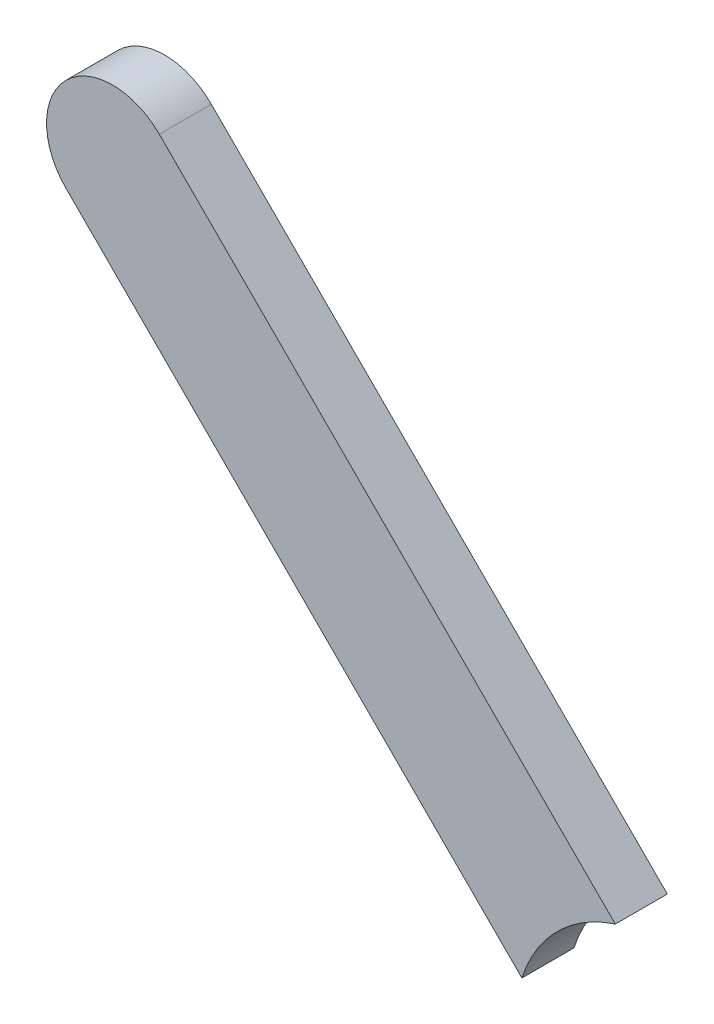
ISO-10303-21;
HEADER;
FILE_DESCRIPTION(('STEP AP214'),'2;1');
FILE_NAME('part.step','',(''),(''),'','','');
FILE_SCHEMA(('AUTOMOTIVE_DESIGN { 1 0 10303 214 1 1 1 1 }'));
ENDSEC;
DATA;
#1=APPLICATION_CONTEXT('core data for automotive mechanical design processes');
#2=APPLICATION_PROTOCOL_DEFINITION('international standard','automotive_design',2000,#1);
#3=PRODUCT_CONTEXT('',#1,'mechanical');
#4=PRODUCT('Part','Part','',(#3));
#5=PRODUCT_RELATED_PRODUCT_CATEGORY('part','',(#4));
#6=PRODUCT_DEFINITION_FORMATION('','',#4);
#7=PRODUCT_DEFINITION_CONTEXT('part definition',#1,'design');
#8=PRODUCT_DEFINITION('design','',#6,#7);
#9=PRODUCT_DEFINITION_SHAPE('','',#8);
#10=(LENGTH_UNIT() NAMED_UNIT(*) SI_UNIT(.MILLI.,.METRE.));
#11=(NAMED_UNIT(*) PLANE_ANGLE_UNIT() SI_UNIT($,.RADIAN.));
#12=(NAMED_UNIT(*) SI_UNIT($,.STERADIAN.) SOLID_ANGLE_UNIT());
#13=UNCERTAINTY_MEASURE_WITH_UNIT(LENGTH_MEASURE(1.E-05),#10,'distance_accuracy_value','');
#14=(GEOMETRIC_REPRESENTATION_CONTEXT(3) GLOBAL_UNCERTAINTY_ASSIGNED_CONTEXT((#13)) GLOBAL_UNIT_ASSIGNED_CONTEXT((#10,
#11,#12)) REPRESENTATION_CONTEXT('',''));
#15=CARTESIAN_POINT('',(0.,0.,0.));
#16=DIRECTION('',(0.,0.,1.));
#17=DIRECTION('',(1.,0.,0.));
#18=AXIS2_PLACEMENT_3D('',#15,#16,#17);
#19=CARTESIAN_POINT('',(91.57088366,82.6919098,0.));
#20=DIRECTION('',(0.707106781186545,0.70710678118655,0.));
#21=DIRECTION('',(0.70710678118655,-0.707106781186545,0.));
#22=AXIS2_PLACEMENT_3D('',#19,#20,#21);
#23=PLANE('',#22);
#24=DIRECTION('',(0.70710678118655,-0.707106781186545,0.));
#25=VECTOR('',#24,1.);
#26=CARTESIAN_POINT('',(91.57088366,82.6919098,0.1999996));
#27=LINE('',#26,#25);
#28=CARTESIAN_POINT('',(91.57088366,82.6919098,0.1999996));
#29=VERTEX_POINT('',#28);
#30=CARTESIAN_POINT('',(93.3244615951531,80.9383318648469,0.1999996));
#31=VERTEX_POINT('',#30);
#32=EDGE_CURVE('E11',#29,#31,#27,.T.);
#33=ORIENTED_EDGE('',*,*,#32,.F.);
#34=DIRECTION('',(0.,0.,1.));
#35=VECTOR('',#34,1.);
#36=CARTESIAN_POINT('',(91.57088366,82.6919098,0.));
#37=LINE('',#36,#35);
#38=CARTESIAN_POINT('',(91.57088366,82.6919098,0.));
#39=VERTEX_POINT('',#38);
#40=EDGE_CURVE('E24',#39,#29,#37,.T.);
#41=ORIENTED_EDGE('',*,*,#40,.F.);
#42=DIRECTION('',(0.70710678118655,-0.707106781186545,0.));
#43=VECTOR('',#42,1.);
#44=CARTESIAN_POINT('',(91.57088366,82.6919098,0.));
#45=LINE('',#44,#43);
#46=CARTESIAN_POINT('',(93.3244615951531,80.9383318648469,0.));
#47=VERTEX_POINT('',#46);
#48=EDGE_CURVE('E75',#39,#47,#45,.T.);
#49=ORIENTED_EDGE('',*,*,#48,.T.);
#50=DIRECTION('',(0.,0.,1.));
#51=VECTOR('',#50,1.);
#52=CARTESIAN_POINT('',(93.3244615951531,80.9383318648469,0.));
#53=LINE('',#52,#51);
#54=EDGE_CURVE('E37',#47,#31,#53,.T.);
#55=ORIENTED_EDGE('',*,*,#54,.T.);
#56=EDGE_LOOP('',(#33,#41,#49,#55));
#57=FACE_BOUND('',#56,.T.);
#58=ADVANCED_FACE('F17',(#57),#23,.F.);
#59=CARTESIAN_POINT('',(93.853,80.7690028,0.));
#60=DIRECTION('',(0.,0.,-1.));
#61=DIRECTION('',(1.,0.,0.));
#62=AXIS2_PLACEMENT_3D('',#59,#60,#61);
#63=CYLINDRICAL_SURFACE('',#62,0.55500016);
#64=DIRECTION('',(0.,0.,1.));
#65=VECTOR('',#64,1.);
#66=CARTESIAN_POINT('',(93.6836709351531,81.2975412048469,0.));
#67=LINE('',#66,#65);
#68=CARTESIAN_POINT('',(93.6836709351531,81.2975412048469,0.));
#69=VERTEX_POINT('',#68);
#70=CARTESIAN_POINT('',(93.6836709351531,81.2975412048469,0.1999996));
#71=VERTEX_POINT('',#70);
#72=EDGE_CURVE('E67',#69,#71,#67,.T.);
#73=ORIENTED_EDGE('',*,*,#72,.T.);
#74=CARTESIAN_POINT('',(93.853,80.7690028,0.1999996));
#75=DIRECTION('',(0.,0.,1.));
#76=DIRECTION('',(1.,0.,0.));
#77=AXIS2_PLACEMENT_3D('',#74,#75,#76);
#78=CIRCLE('',#77,0.55500016);
#79=EDGE_CURVE('E82',#71,#31,#78,.T.);
#80=ORIENTED_EDGE('',*,*,#79,.T.);
#81=ORIENTED_EDGE('',*,*,#54,.F.);
#82=CARTESIAN_POINT('',(93.853,80.7690028,0.));
#83=DIRECTION('',(0.,0.,1.));
#84=DIRECTION('',(1.,0.,0.));
#85=AXIS2_PLACEMENT_3D('',#82,#83,#84);
#86=CIRCLE('',#85,0.55500016);
#87=EDGE_CURVE('E80',#69,#47,#86,.T.);
#88=ORIENTED_EDGE('',*,*,#87,.F.);
#89=EDGE_LOOP('',(#73,#80,#81,#88));
#90=FACE_BOUND('',#89,.T.);
#91=ADVANCED_FACE('F88',(#90),#63,.F.);
#92=CARTESIAN_POINT('',(93.6836709351531,81.2975412048469,0.));
#93=DIRECTION('',(-0.70710678118655,-0.707106781186545,0.));
#94=DIRECTION('',(-0.707106781186545,0.70710678118655,0.));
#95=AXIS2_PLACEMENT_3D('',#92,#93,#94);
#96=PLANE('',#95);
#97=DIRECTION('',(-0.707106781186545,0.70710678118655,0.));
#98=VECTOR('',#97,1.);
#99=CARTESIAN_POINT('',(94.03260594,80.9486062,0.1999996));
#100=LINE('',#99,#98);
#101=CARTESIAN_POINT('',(91.930093,83.05111914,0.1999996));
#102=VERTEX_POINT('',#101);
#103=EDGE_CURVE('E71',#71,#102,#100,.T.);
#104=ORIENTED_EDGE('',*,*,#103,.F.);
#105=ORIENTED_EDGE('',*,*,#72,.F.);
#106=DIRECTION('',(-0.707106781186545,0.70710678118655,0.));
#107=VECTOR('',#106,1.);
#108=CARTESIAN_POINT('',(94.03260594,80.9486062,0.));
#109=LINE('',#108,#107);
#110=CARTESIAN_POINT('',(91.930093,83.05111914,0.));
#111=VERTEX_POINT('',#110);
#112=EDGE_CURVE('E63',#69,#111,#109,.T.);
#113=ORIENTED_EDGE('',*,*,#112,.T.);
#114=DIRECTION('',(0.,0.,1.));
#115=VECTOR('',#114,1.);
#116=CARTESIAN_POINT('',(91.930093,83.05111914,0.));
#117=LINE('',#116,#115);
#118=EDGE_CURVE('E53',#111,#102,#117,.T.);
#119=ORIENTED_EDGE('',*,*,#118,.T.);
#120=EDGE_LOOP('',(#104,#105,#113,#119));
#121=FACE_BOUND('',#120,.T.);
#122=ADVANCED_FACE('F66',(#121),#96,.F.);
#123=CARTESIAN_POINT('',(91.75048833,82.87151447,0.));
#124=DIRECTION('',(0.,0.,-1.));
#125=DIRECTION('',(0.707106781186548,0.707106781186548,0.));
#126=AXIS2_PLACEMENT_3D('',#123,#124,#125);
#127=CYLINDRICAL_SURFACE('',#126,0.253999360179546);
#128=CARTESIAN_POINT('',(91.75048833,82.87151447,0.1999996));
#129=DIRECTION('',(0.,0.,1.));
#130=DIRECTION('',(0.707106781186548,0.707106781186548,0.));
#131=AXIS2_PLACEMENT_3D('',#128,#129,#130);
#132=CIRCLE('',#131,0.253999360179546);
#133=EDGE_CURVE('E59',#102,#29,#132,.T.);
#134=ORIENTED_EDGE('',*,*,#133,.F.);
#135=ORIENTED_EDGE('',*,*,#118,.F.);
#136=CARTESIAN_POINT('',(91.75048833,82.87151447,0.));
#137=DIRECTION('',(0.,0.,1.));
#138=DIRECTION('',(0.707106781186548,0.707106781186548,0.));
#139=AXIS2_PLACEMENT_3D('',#136,#137,#138);
#140=CIRCLE('',#139,0.253999360179546);
#141=EDGE_CURVE('E57',#111,#39,#140,.T.);
#142=ORIENTED_EDGE('',*,*,#141,.T.);
#143=ORIENTED_EDGE('',*,*,#40,.T.);
#144=EDGE_LOOP('',(#134,#135,#142,#143));
#145=FACE_BOUND('',#144,.T.);
#146=ADVANCED_FACE('F55',(#145),#127,.T.);
#147=CARTESIAN_POINT('',(91.57088366,82.6919098,0.));
#148=DIRECTION('',(0.,0.,-1.));
#149=DIRECTION('',(-1.,0.,0.));
#150=AXIS2_PLACEMENT_3D('',#147,#148,#149);
#151=PLANE('',#150);
#152=ORIENTED_EDGE('',*,*,#48,.F.);
#153=ORIENTED_EDGE('',*,*,#141,.F.);
#154=ORIENTED_EDGE('',*,*,#112,.F.);
#155=ORIENTED_EDGE('',*,*,#87,.T.);
#156=EDGE_LOOP('',(#152,#153,#154,#155));
#157=FACE_BOUND('',#156,.T.);
#158=ADVANCED_FACE('F74',(#157),#151,.T.);
#159=CARTESIAN_POINT('',(91.57088366,82.6919098,0.1999996));
#160=DIRECTION('',(0.,0.,-1.));
#161=DIRECTION('',(-1.,0.,0.));
#162=AXIS2_PLACEMENT_3D('',#159,#160,#161);
#163=PLANE('',#162);
#164=ORIENTED_EDGE('',*,*,#133,.T.);
#165=ORIENTED_EDGE('',*,*,#32,.T.);
#166=ORIENTED_EDGE('',*,*,#79,.F.);
#167=ORIENTED_EDGE('',*,*,#103,.T.);
#168=EDGE_LOOP('',(#164,#165,#166,#167));
#169=FACE_BOUND('',#168,.T.);
#170=ADVANCED_FACE('F91',(#169),#163,.F.);
#171=CLOSED_SHELL('',(#58,#91,#122,#146,#158,#170));
#172=MANIFOLD_SOLID_BREP('B1',#171);
#173=ADVANCED_BREP_SHAPE_REPRESENTATION('',(#18,#172),#14);
#174=SHAPE_DEFINITION_REPRESENTATION(#9,#173);
ENDSEC;
END-ISO-10303-21;
